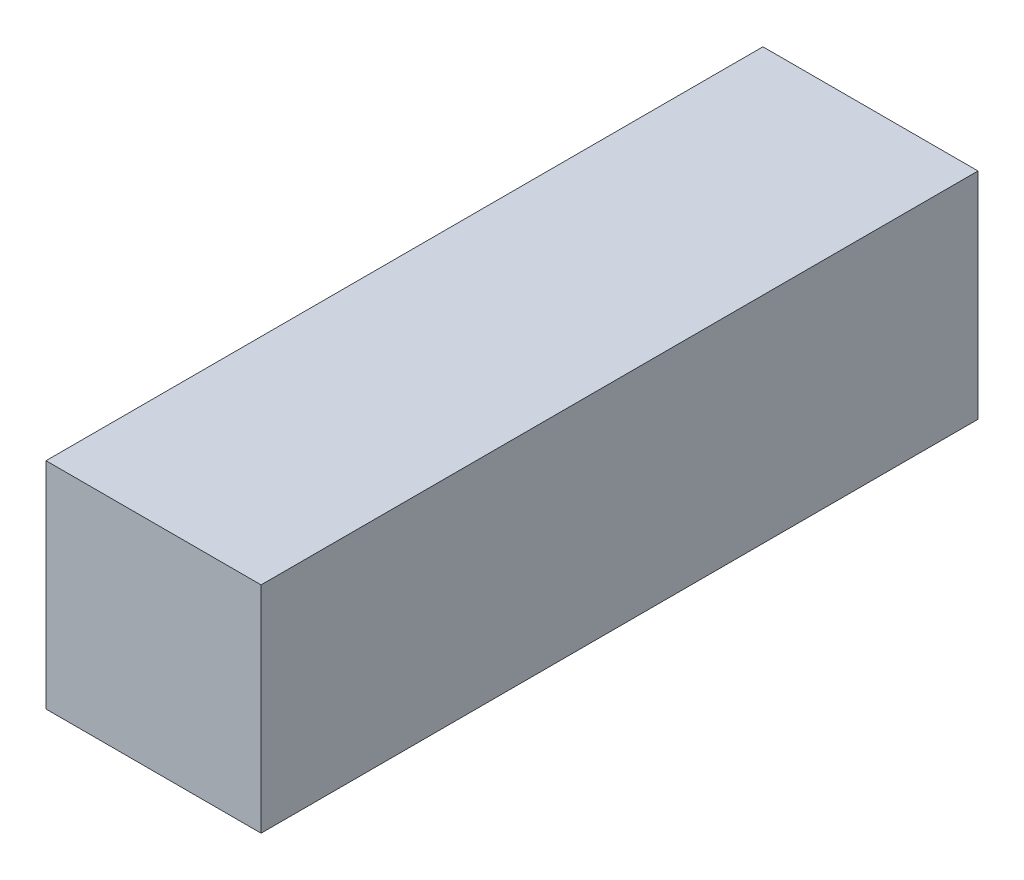
ISO-10303-21;
HEADER;
FILE_DESCRIPTION(('STEP AP214'),'2;1');
FILE_NAME('part.step','',(''),(''),'','','');
FILE_SCHEMA(('AUTOMOTIVE_DESIGN { 1 0 10303 214 1 1 1 1 }'));
ENDSEC;
DATA;
#1=APPLICATION_CONTEXT('core data for automotive mechanical design processes');
#2=APPLICATION_PROTOCOL_DEFINITION('international standard','automotive_design',2000,#1);
#3=PRODUCT_CONTEXT('',#1,'mechanical');
#4=PRODUCT('Part','Part','',(#3));
#5=PRODUCT_RELATED_PRODUCT_CATEGORY('part','',(#4));
#6=PRODUCT_DEFINITION_FORMATION('','',#4);
#7=PRODUCT_DEFINITION_CONTEXT('part definition',#1,'design');
#8=PRODUCT_DEFINITION('design','',#6,#7);
#9=PRODUCT_DEFINITION_SHAPE('','',#8);
#10=(LENGTH_UNIT() NAMED_UNIT(*) SI_UNIT(.MILLI.,.METRE.));
#11=(NAMED_UNIT(*) PLANE_ANGLE_UNIT() SI_UNIT($,.RADIAN.));
#12=(NAMED_UNIT(*) SI_UNIT($,.STERADIAN.) SOLID_ANGLE_UNIT());
#13=UNCERTAINTY_MEASURE_WITH_UNIT(LENGTH_MEASURE(1.E-05),#10,'distance_accuracy_value','');
#14=(GEOMETRIC_REPRESENTATION_CONTEXT(3) GLOBAL_UNCERTAINTY_ASSIGNED_CONTEXT((#13)) GLOBAL_UNIT_ASSIGNED_CONTEXT((#10,
#11,#12)) REPRESENTATION_CONTEXT('',''));
#15=CARTESIAN_POINT('',(0.,0.,0.));
#16=DIRECTION('',(0.,0.,1.));
#17=DIRECTION('',(1.,0.,0.));
#18=AXIS2_PLACEMENT_3D('',#15,#16,#17);
#19=CARTESIAN_POINT('',(1.5,-1.5,10.));
#20=DIRECTION('',(-1.,0.,0.));
#21=DIRECTION('',(0.,0.,1.));
#22=AXIS2_PLACEMENT_3D('',#19,#20,#21);
#23=PLANE('',#22);
#24=DIRECTION('',(0.,1.,0.));
#25=VECTOR('',#24,1.);
#26=CARTESIAN_POINT('',(1.5,-1.5,0.));
#27=LINE('',#26,#25);
#28=CARTESIAN_POINT('',(1.5,-1.5,0.));
#29=VERTEX_POINT('',#28);
#30=CARTESIAN_POINT('',(1.5,1.5,0.));
#31=VERTEX_POINT('',#30);
#32=EDGE_CURVE('E96',#29,#31,#27,.T.);
#33=ORIENTED_EDGE('',*,*,#32,.T.);
#34=DIRECTION('',(0.,0.,-1.));
#35=VECTOR('',#34,1.);
#36=CARTESIAN_POINT('',(1.5,1.5,10.));
#37=LINE('',#36,#35);
#38=CARTESIAN_POINT('',(1.5,1.5,10.));
#39=VERTEX_POINT('',#38);
#40=EDGE_CURVE('E11',#39,#31,#37,.T.);
#41=ORIENTED_EDGE('',*,*,#40,.F.);
#42=DIRECTION('',(0.,1.,0.));
#43=VECTOR('',#42,1.);
#44=CARTESIAN_POINT('',(1.5,-1.5,10.));
#45=LINE('',#44,#43);
#46=CARTESIAN_POINT('',(1.5,-1.5,10.));
#47=VERTEX_POINT('',#46);
#48=EDGE_CURVE('E84',#47,#39,#45,.T.);
#49=ORIENTED_EDGE('',*,*,#48,.F.);
#50=DIRECTION('',(0.,0.,-1.));
#51=VECTOR('',#50,1.);
#52=CARTESIAN_POINT('',(1.5,-1.5,10.));
#53=LINE('',#52,#51);
#54=EDGE_CURVE('E92',#47,#29,#53,.T.);
#55=ORIENTED_EDGE('',*,*,#54,.T.);
#56=EDGE_LOOP('',(#33,#41,#49,#55));
#57=FACE_BOUND('',#56,.T.);
#58=ADVANCED_FACE('F33',(#57),#23,.F.);
#59=CARTESIAN_POINT('',(-1.5,1.5,10.));
#60=DIRECTION('',(0.,-1.,0.));
#61=DIRECTION('',(0.,0.,-1.));
#62=AXIS2_PLACEMENT_3D('',#59,#60,#61);
#63=PLANE('',#62);
#64=DIRECTION('',(-1.,0.,0.));
#65=VECTOR('',#64,1.);
#66=CARTESIAN_POINT('',(-1.5,1.5,0.));
#67=LINE('',#66,#65);
#68=CARTESIAN_POINT('',(-1.5,1.5,0.));
#69=VERTEX_POINT('',#68);
#70=EDGE_CURVE('E88',#31,#69,#67,.T.);
#71=ORIENTED_EDGE('',*,*,#70,.T.);
#72=DIRECTION('',(0.,0.,-1.));
#73=VECTOR('',#72,1.);
#74=CARTESIAN_POINT('',(-1.5,1.5,10.));
#75=LINE('',#74,#73);
#76=CARTESIAN_POINT('',(-1.5,1.5,10.));
#77=VERTEX_POINT('',#76);
#78=EDGE_CURVE('E41',#77,#69,#75,.T.);
#79=ORIENTED_EDGE('',*,*,#78,.F.);
#80=DIRECTION('',(-1.,0.,0.));
#81=VECTOR('',#80,1.);
#82=CARTESIAN_POINT('',(-1.5,1.5,10.));
#83=LINE('',#82,#81);
#84=EDGE_CURVE('E79',#39,#77,#83,.T.);
#85=ORIENTED_EDGE('',*,*,#84,.F.);
#86=ORIENTED_EDGE('',*,*,#40,.T.);
#87=EDGE_LOOP('',(#71,#79,#85,#86));
#88=FACE_BOUND('',#87,.T.);
#89=ADVANCED_FACE('F87',(#88),#63,.F.);
#90=CARTESIAN_POINT('',(-1.5,-1.5,10.));
#91=DIRECTION('',(1.,0.,0.));
#92=DIRECTION('',(0.,0.,-1.));
#93=AXIS2_PLACEMENT_3D('',#90,#91,#92);
#94=PLANE('',#93);
#95=DIRECTION('',(0.,-1.,0.));
#96=VECTOR('',#95,1.);
#97=CARTESIAN_POINT('',(-1.5,-1.5,0.));
#98=LINE('',#97,#96);
#99=CARTESIAN_POINT('',(-1.5,-1.5,0.));
#100=VERTEX_POINT('',#99);
#101=EDGE_CURVE('E66',#69,#100,#98,.T.);
#102=ORIENTED_EDGE('',*,*,#101,.T.);
#103=DIRECTION('',(0.,0.,-1.));
#104=VECTOR('',#103,1.);
#105=CARTESIAN_POINT('',(-1.5,-1.5,10.));
#106=LINE('',#105,#104);
#107=CARTESIAN_POINT('',(-1.5,-1.5,10.));
#108=VERTEX_POINT('',#107);
#109=EDGE_CURVE('E89',#108,#100,#106,.T.);
#110=ORIENTED_EDGE('',*,*,#109,.F.);
#111=DIRECTION('',(0.,-1.,0.));
#112=VECTOR('',#111,1.);
#113=CARTESIAN_POINT('',(-1.5,-1.5,10.));
#114=LINE('',#113,#112);
#115=EDGE_CURVE('E82',#77,#108,#114,.T.);
#116=ORIENTED_EDGE('',*,*,#115,.F.);
#117=ORIENTED_EDGE('',*,*,#78,.T.);
#118=EDGE_LOOP('',(#102,#110,#116,#117));
#119=FACE_BOUND('',#118,.T.);
#120=ADVANCED_FACE('F90',(#119),#94,.F.);
#121=CARTESIAN_POINT('',(-1.5,-1.5,10.));
#122=DIRECTION('',(0.,1.,0.));
#123=DIRECTION('',(-1.,0.,0.));
#124=AXIS2_PLACEMENT_3D('',#121,#122,#123);
#125=PLANE('',#124);
#126=DIRECTION('',(1.,0.,0.));
#127=VECTOR('',#126,1.);
#128=CARTESIAN_POINT('',(-1.5,-1.5,0.));
#129=LINE('',#128,#127);
#130=EDGE_CURVE('E72',#100,#29,#129,.T.);
#131=ORIENTED_EDGE('',*,*,#130,.T.);
#132=ORIENTED_EDGE('',*,*,#54,.F.);
#133=DIRECTION('',(1.,0.,0.));
#134=VECTOR('',#133,1.);
#135=CARTESIAN_POINT('',(-1.5,-1.5,10.));
#136=LINE('',#135,#134);
#137=EDGE_CURVE('E49',#108,#47,#136,.T.);
#138=ORIENTED_EDGE('',*,*,#137,.F.);
#139=ORIENTED_EDGE('',*,*,#109,.T.);
#140=EDGE_LOOP('',(#131,#132,#138,#139));
#141=FACE_BOUND('',#140,.T.);
#142=ADVANCED_FACE('F103',(#141),#125,.F.);
#143=CARTESIAN_POINT('',(0.,0.,10.));
#144=DIRECTION('',(0.,0.,-1.));
#145=DIRECTION('',(-1.,0.,0.));
#146=AXIS2_PLACEMENT_3D('',#143,#144,#145);
#147=PLANE('',#146);
#148=ORIENTED_EDGE('',*,*,#48,.T.);
#149=ORIENTED_EDGE('',*,*,#84,.T.);
#150=ORIENTED_EDGE('',*,*,#115,.T.);
#151=ORIENTED_EDGE('',*,*,#137,.T.);
#152=EDGE_LOOP('',(#148,#149,#150,#151));
#153=FACE_BOUND('',#152,.T.);
#154=ADVANCED_FACE('F80',(#153),#147,.F.);
#155=CARTESIAN_POINT('',(0.,0.,0.));
#156=DIRECTION('',(0.,0.,-1.));
#157=DIRECTION('',(-1.,0.,0.));
#158=AXIS2_PLACEMENT_3D('',#155,#156,#157);
#159=PLANE('',#158);
#160=ORIENTED_EDGE('',*,*,#32,.F.);
#161=ORIENTED_EDGE('',*,*,#130,.F.);
#162=ORIENTED_EDGE('',*,*,#101,.F.);
#163=ORIENTED_EDGE('',*,*,#70,.F.);
#164=EDGE_LOOP('',(#160,#161,#162,#163));
#165=FACE_BOUND('',#164,.T.);
#166=ADVANCED_FACE('F106',(#165),#159,.T.);
#167=CLOSED_SHELL('',(#58,#89,#120,#142,#154,#166));
#168=MANIFOLD_SOLID_BREP('B2',#167);
#169=ADVANCED_BREP_SHAPE_REPRESENTATION('',(#18,#168),#14);
#170=SHAPE_DEFINITION_REPRESENTATION(#9,#169);
ENDSEC;
END-ISO-10303-21;
